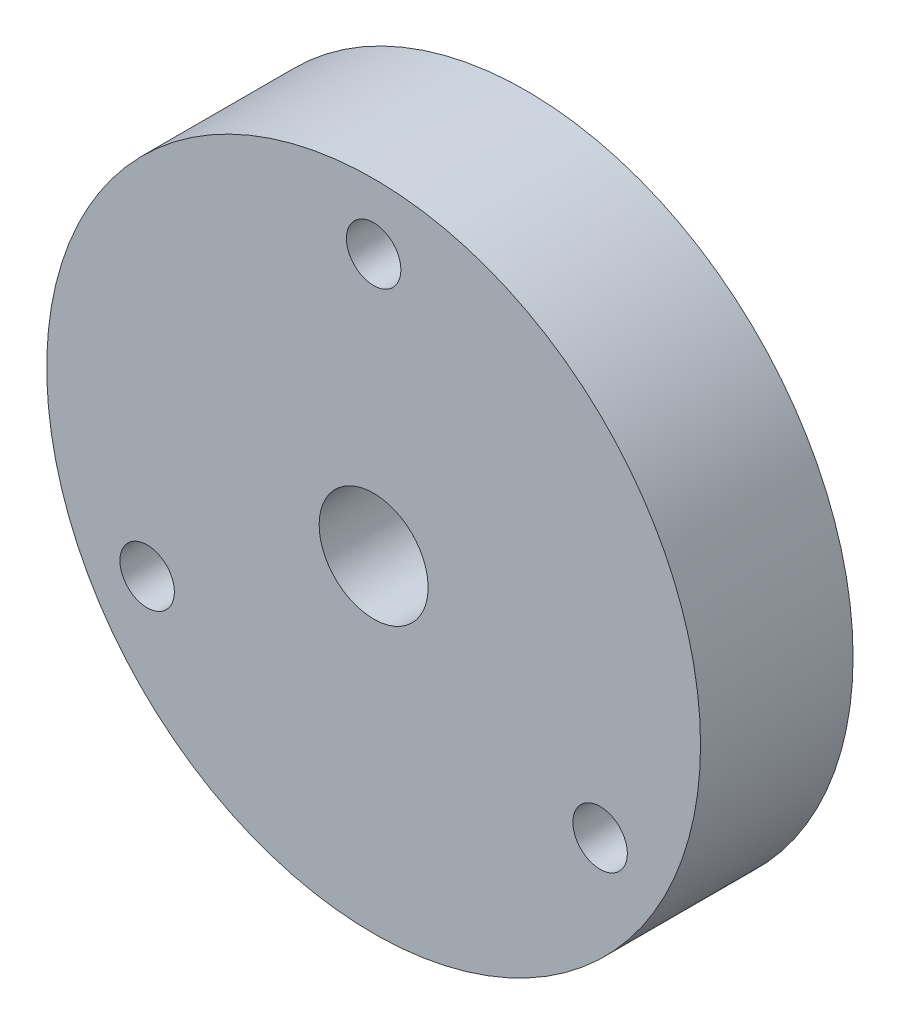
ISO-10303-21;
HEADER;
FILE_DESCRIPTION(('STEP AP214'),'2;1');
FILE_NAME('part.step','',(''),(''),'','','');
FILE_SCHEMA(('AUTOMOTIVE_DESIGN { 1 0 10303 214 1 1 1 1 }'));
ENDSEC;
DATA;
#1=APPLICATION_CONTEXT('core data for automotive mechanical design processes');
#2=APPLICATION_PROTOCOL_DEFINITION('international standard','automotive_design',2000,#1);
#3=PRODUCT_CONTEXT('',#1,'mechanical');
#4=PRODUCT('Part','Part','',(#3));
#5=PRODUCT_RELATED_PRODUCT_CATEGORY('part','',(#4));
#6=PRODUCT_DEFINITION_FORMATION('','',#4);
#7=PRODUCT_DEFINITION_CONTEXT('part definition',#1,'design');
#8=PRODUCT_DEFINITION('design','',#6,#7);
#9=PRODUCT_DEFINITION_SHAPE('','',#8);
#10=(LENGTH_UNIT() NAMED_UNIT(*) SI_UNIT(.MILLI.,.METRE.));
#11=(NAMED_UNIT(*) PLANE_ANGLE_UNIT() SI_UNIT($,.RADIAN.));
#12=(NAMED_UNIT(*) SI_UNIT($,.STERADIAN.) SOLID_ANGLE_UNIT());
#13=UNCERTAINTY_MEASURE_WITH_UNIT(LENGTH_MEASURE(1.E-05),#10,'distance_accuracy_value','');
#14=(GEOMETRIC_REPRESENTATION_CONTEXT(3) GLOBAL_UNCERTAINTY_ASSIGNED_CONTEXT((#13)) GLOBAL_UNIT_ASSIGNED_CONTEXT((#10,
#11,#12)) REPRESENTATION_CONTEXT('',''));
#15=CARTESIAN_POINT('',(0.,0.,0.));
#16=DIRECTION('',(0.,0.,1.));
#17=DIRECTION('',(1.,0.,0.));
#18=AXIS2_PLACEMENT_3D('',#15,#16,#17);
#19=CARTESIAN_POINT('',(0.,0.,7.));
#20=DIRECTION('',(0.,0.,-1.));
#21=DIRECTION('',(-1.,0.,0.));
#22=AXIS2_PLACEMENT_3D('',#19,#20,#21);
#23=CYLINDRICAL_SURFACE('',#22,15.);
#24=CARTESIAN_POINT('',(0.,0.,7.));
#25=DIRECTION('',(0.,0.,1.));
#26=DIRECTION('',(1.,0.,0.));
#27=AXIS2_PLACEMENT_3D('',#24,#25,#26);
#28=CIRCLE('',#27,15.);
#29=CARTESIAN_POINT('',(15.,0.,7.));
#30=VERTEX_POINT('',#29);
#31=EDGE_CURVE('E10',#30,#30,#28,.T.);
#32=ORIENTED_EDGE('',*,*,#31,.F.);
#33=EDGE_LOOP('',(#32));
#34=FACE_BOUND('',#33,.T.);
#35=CARTESIAN_POINT('',(0.,0.,0.));
#36=DIRECTION('',(0.,0.,1.));
#37=DIRECTION('',(1.,0.,0.));
#38=AXIS2_PLACEMENT_3D('',#35,#36,#37);
#39=CIRCLE('',#38,15.);
#40=CARTESIAN_POINT('',(15.,0.,0.));
#41=VERTEX_POINT('',#40);
#42=EDGE_CURVE('E34',#41,#41,#39,.T.);
#43=ORIENTED_EDGE('',*,*,#42,.T.);
#44=EDGE_LOOP('',(#43));
#45=FACE_BOUND('',#44,.T.);
#46=ADVANCED_FACE('F31',(#34,#45),#23,.T.);
#47=CARTESIAN_POINT('',(0.,0.,7.));
#48=DIRECTION('',(0.,0.,1.));
#49=DIRECTION('',(1.,0.,0.));
#50=AXIS2_PLACEMENT_3D('',#47,#48,#49);
#51=PLANE('',#50);
#52=CARTESIAN_POINT('',(-10.3923048454133,-5.99999999999998,7.));
#53=DIRECTION('',(0.,0.,1.));
#54=DIRECTION('',(1.,0.,0.));
#55=AXIS2_PLACEMENT_3D('',#52,#53,#54);
#56=CIRCLE('',#55,1.24999999999997);
#57=CARTESIAN_POINT('',(-9.14230484541334,-5.99999999999998,7.));
#58=VERTEX_POINT('',#57);
#59=EDGE_CURVE('E61',#58,#58,#56,.T.);
#60=ORIENTED_EDGE('',*,*,#59,.F.);
#61=EDGE_LOOP('',(#60));
#62=FACE_BOUND('',#61,.T.);
#63=CARTESIAN_POINT('',(10.3923048454132,-5.99999999999998,7.));
#64=DIRECTION('',(0.,0.,1.));
#65=DIRECTION('',(1.,0.,0.));
#66=AXIS2_PLACEMENT_3D('',#63,#64,#65);
#67=CIRCLE('',#66,1.24999999999997);
#68=CARTESIAN_POINT('',(11.6423048454132,-5.99999999999998,7.));
#69=VERTEX_POINT('',#68);
#70=EDGE_CURVE('E55',#69,#69,#67,.T.);
#71=ORIENTED_EDGE('',*,*,#70,.F.);
#72=EDGE_LOOP('',(#71));
#73=FACE_BOUND('',#72,.T.);
#74=CARTESIAN_POINT('',(0.,12.,7.));
#75=DIRECTION('',(0.,0.,1.));
#76=DIRECTION('',(1.,0.,0.));
#77=AXIS2_PLACEMENT_3D('',#74,#75,#76);
#78=CIRCLE('',#77,1.25000000000003);
#79=CARTESIAN_POINT('',(1.25000000000003,12.,7.));
#80=VERTEX_POINT('',#79);
#81=EDGE_CURVE('E49',#80,#80,#78,.T.);
#82=ORIENTED_EDGE('',*,*,#81,.F.);
#83=EDGE_LOOP('',(#82));
#84=FACE_BOUND('',#83,.T.);
#85=CARTESIAN_POINT('',(0.,0.,7.));
#86=DIRECTION('',(0.,0.,-1.));
#87=DIRECTION('',(-1.,0.,0.));
#88=AXIS2_PLACEMENT_3D('',#85,#86,#87);
#89=CIRCLE('',#88,2.5);
#90=CARTESIAN_POINT('',(-2.5,0.,7.));
#91=VERTEX_POINT('',#90);
#92=EDGE_CURVE('E41',#91,#91,#89,.T.);
#93=ORIENTED_EDGE('',*,*,#92,.T.);
#94=EDGE_LOOP('',(#93));
#95=FACE_BOUND('',#94,.T.);
#96=ORIENTED_EDGE('',*,*,#31,.T.);
#97=EDGE_LOOP('',(#96));
#98=FACE_BOUND('',#97,.T.);
#99=ADVANCED_FACE('F77',(#62,#73,#84,#95,#98),#51,.T.);
#100=CARTESIAN_POINT('',(0.,0.,0.));
#101=DIRECTION('',(0.,0.,1.));
#102=DIRECTION('',(1.,0.,0.));
#103=AXIS2_PLACEMENT_3D('',#100,#101,#102);
#104=PLANE('',#103);
#105=CARTESIAN_POINT('',(-10.3923048454133,-5.99999999999998,0.));
#106=DIRECTION('',(0.,0.,1.));
#107=DIRECTION('',(1.,0.,0.));
#108=AXIS2_PLACEMENT_3D('',#105,#106,#107);
#109=CIRCLE('',#108,1.24999999999997);
#110=CARTESIAN_POINT('',(-9.14230484541334,-5.99999999999998,0.));
#111=VERTEX_POINT('',#110);
#112=EDGE_CURVE('E58',#111,#111,#109,.T.);
#113=ORIENTED_EDGE('',*,*,#112,.T.);
#114=EDGE_LOOP('',(#113));
#115=FACE_BOUND('',#114,.T.);
#116=CARTESIAN_POINT('',(10.3923048454132,-5.99999999999998,0.));
#117=DIRECTION('',(0.,0.,1.));
#118=DIRECTION('',(1.,0.,0.));
#119=AXIS2_PLACEMENT_3D('',#116,#117,#118);
#120=CIRCLE('',#119,1.24999999999997);
#121=CARTESIAN_POINT('',(11.6423048454132,-5.99999999999998,0.));
#122=VERTEX_POINT('',#121);
#123=EDGE_CURVE('E52',#122,#122,#120,.T.);
#124=ORIENTED_EDGE('',*,*,#123,.T.);
#125=EDGE_LOOP('',(#124));
#126=FACE_BOUND('',#125,.T.);
#127=CARTESIAN_POINT('',(0.,12.,0.));
#128=DIRECTION('',(0.,0.,1.));
#129=DIRECTION('',(1.,0.,0.));
#130=AXIS2_PLACEMENT_3D('',#127,#128,#129);
#131=CIRCLE('',#130,1.25000000000003);
#132=CARTESIAN_POINT('',(1.25000000000003,12.,0.));
#133=VERTEX_POINT('',#132);
#134=EDGE_CURVE('E46',#133,#133,#131,.T.);
#135=ORIENTED_EDGE('',*,*,#134,.T.);
#136=EDGE_LOOP('',(#135));
#137=FACE_BOUND('',#136,.T.);
#138=CARTESIAN_POINT('',(0.,0.,0.));
#139=DIRECTION('',(0.,0.,-1.));
#140=DIRECTION('',(-1.,0.,0.));
#141=AXIS2_PLACEMENT_3D('',#138,#139,#140);
#142=CIRCLE('',#141,2.5);
#143=CARTESIAN_POINT('',(-2.5,0.,0.));
#144=VERTEX_POINT('',#143);
#145=EDGE_CURVE('E43',#144,#144,#142,.T.);
#146=ORIENTED_EDGE('',*,*,#145,.F.);
#147=EDGE_LOOP('',(#146));
#148=FACE_BOUND('',#147,.T.);
#149=ORIENTED_EDGE('',*,*,#42,.F.);
#150=EDGE_LOOP('',(#149));
#151=FACE_BOUND('',#150,.T.);
#152=ADVANCED_FACE('F67',(#115,#126,#137,#148,#151),#104,.F.);
#153=CARTESIAN_POINT('',(0.,0.,7.));
#154=DIRECTION('',(0.,0.,-1.));
#155=DIRECTION('',(-1.,0.,0.));
#156=AXIS2_PLACEMENT_3D('',#153,#154,#155);
#157=CYLINDRICAL_SURFACE('',#156,2.5);
#158=ORIENTED_EDGE('',*,*,#92,.F.);
#159=EDGE_LOOP('',(#158));
#160=FACE_BOUND('',#159,.T.);
#161=ORIENTED_EDGE('',*,*,#145,.T.);
#162=EDGE_LOOP('',(#161));
#163=FACE_BOUND('',#162,.T.);
#164=ADVANCED_FACE('F87',(#160,#163),#157,.F.);
#165=CARTESIAN_POINT('',(0.,12.,0.));
#166=DIRECTION('',(0.,0.,1.));
#167=DIRECTION('',(1.,0.,0.));
#168=AXIS2_PLACEMENT_3D('',#165,#166,#167);
#169=CYLINDRICAL_SURFACE('',#168,1.25000000000003);
#170=ORIENTED_EDGE('',*,*,#134,.F.);
#171=EDGE_LOOP('',(#170));
#172=FACE_BOUND('',#171,.T.);
#173=ORIENTED_EDGE('',*,*,#81,.T.);
#174=EDGE_LOOP('',(#173));
#175=FACE_BOUND('',#174,.T.);
#176=ADVANCED_FACE('F90',(#172,#175),#169,.F.);
#177=CARTESIAN_POINT('',(10.3923048454132,-5.99999999999998,0.));
#178=DIRECTION('',(0.,0.,1.));
#179=DIRECTION('',(1.,0.,0.));
#180=AXIS2_PLACEMENT_3D('',#177,#178,#179);
#181=CYLINDRICAL_SURFACE('',#180,1.24999999999997);
#182=ORIENTED_EDGE('',*,*,#123,.F.);
#183=EDGE_LOOP('',(#182));
#184=FACE_BOUND('',#183,.T.);
#185=ORIENTED_EDGE('',*,*,#70,.T.);
#186=EDGE_LOOP('',(#185));
#187=FACE_BOUND('',#186,.T.);
#188=ADVANCED_FACE('F73',(#184,#187),#181,.F.);
#189=CARTESIAN_POINT('',(-10.3923048454133,-5.99999999999998,0.));
#190=DIRECTION('',(0.,0.,1.));
#191=DIRECTION('',(1.,0.,0.));
#192=AXIS2_PLACEMENT_3D('',#189,#190,#191);
#193=CYLINDRICAL_SURFACE('',#192,1.24999999999997);
#194=ORIENTED_EDGE('',*,*,#112,.F.);
#195=EDGE_LOOP('',(#194));
#196=FACE_BOUND('',#195,.T.);
#197=ORIENTED_EDGE('',*,*,#59,.T.);
#198=EDGE_LOOP('',(#197));
#199=FACE_BOUND('',#198,.T.);
#200=ADVANCED_FACE('F70',(#196,#199),#193,.F.);
#201=CLOSED_SHELL('',(#46,#99,#152,#164,#176,#188,#200));
#202=MANIFOLD_SOLID_BREP('B2',#201);
#203=ADVANCED_BREP_SHAPE_REPRESENTATION('',(#18,#202),#14);
#204=SHAPE_DEFINITION_REPRESENTATION(#9,#203);
ENDSEC;
END-ISO-10303-21;
